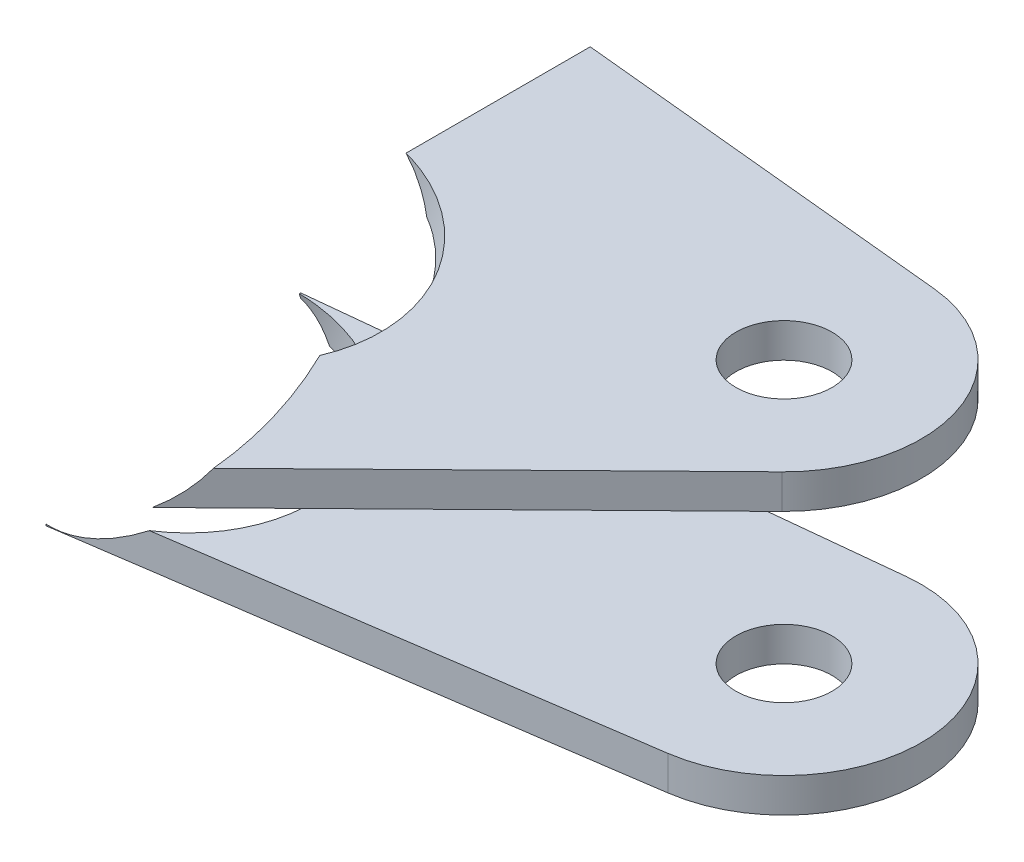
ISO-10303-21;
HEADER;
FILE_DESCRIPTION(('STEP AP214'),'2;1');
FILE_NAME('part.step','',(''),(''),'','','');
FILE_SCHEMA(('AUTOMOTIVE_DESIGN { 1 0 10303 214 1 1 1 1 }'));
ENDSEC;
DATA;
#1=APPLICATION_CONTEXT('core data for automotive mechanical design processes');
#2=APPLICATION_PROTOCOL_DEFINITION('international standard','automotive_design',2000,#1);
#3=PRODUCT_CONTEXT('',#1,'mechanical');
#4=PRODUCT('Part','Part','',(#3));
#5=PRODUCT_RELATED_PRODUCT_CATEGORY('part','',(#4));
#6=PRODUCT_DEFINITION_FORMATION('','',#4);
#7=PRODUCT_DEFINITION_CONTEXT('part definition',#1,'design');
#8=PRODUCT_DEFINITION('design','',#6,#7);
#9=PRODUCT_DEFINITION_SHAPE('','',#8);
#10=(LENGTH_UNIT() NAMED_UNIT(*) SI_UNIT(.MILLI.,.METRE.));
#11=(NAMED_UNIT(*) PLANE_ANGLE_UNIT() SI_UNIT($,.RADIAN.));
#12=(NAMED_UNIT(*) SI_UNIT($,.STERADIAN.) SOLID_ANGLE_UNIT());
#13=UNCERTAINTY_MEASURE_WITH_UNIT(LENGTH_MEASURE(1.E-05),#10,'distance_accuracy_value','');
#14=(GEOMETRIC_REPRESENTATION_CONTEXT(3) GLOBAL_UNCERTAINTY_ASSIGNED_CONTEXT((#13)) GLOBAL_UNIT_ASSIGNED_CONTEXT((#10,
#11,#12)) REPRESENTATION_CONTEXT('',''));
#15=CARTESIAN_POINT('',(0.,0.,0.));
#16=DIRECTION('',(0.,0.,1.));
#17=DIRECTION('',(1.,0.,0.));
#18=AXIS2_PLACEMENT_3D('',#15,#16,#17);
#19=CARTESIAN_POINT('',(0.,129.999999999984,0.));
#20=DIRECTION('',(0.,1.,0.));
#21=DIRECTION('',(0.,0.,1.));
#22=AXIS2_PLACEMENT_3D('',#19,#20,#21);
#23=PLANE('',#22);
#24=CARTESIAN_POINT('',(150.000000000001,129.999999999983,-413.499999999996));
#25=DIRECTION('',(0.,1.,0.));
#26=DIRECTION('',(0.,0.,1.));
#27=AXIS2_PLACEMENT_3D('',#24,#25,#26);
#28=CIRCLE('',#27,4.2);
#29=CARTESIAN_POINT('',(150.000000000001,129.999999999983,-409.299999999996));
#30=VERTEX_POINT('',#29);
#31=EDGE_CURVE('E223',#30,#30,#28,.T.);
#32=ORIENTED_EDGE('',*,*,#31,.F.);
#33=EDGE_LOOP('',(#32));
#34=FACE_BOUND('',#33,.T.);
#35=DIRECTION('',(-0.995181623730551,0.,-0.0980486399141967));
#36=VECTOR('',#35,1.);
#37=CARTESIAN_POINT('',(151.176583678971,129.999999999983,-425.442179484763));
#38=LINE('',#37,#36);
#39=CARTESIAN_POINT('',(151.176583678971,129.999999999983,-425.442179484763));
#40=VERTEX_POINT('',#39);
#41=CARTESIAN_POINT('',(117.828793010442,129.999999999983,-428.727715954916));
#42=VERTEX_POINT('',#41);
#43=EDGE_CURVE('E242',#40,#42,#38,.T.);
#44=ORIENTED_EDGE('',*,*,#43,.T.);
#45=DIRECTION('',(0.,0.,-1.));
#46=VECTOR('',#45,1.);
#47=CARTESIAN_POINT('',(117.828793010442,129.999999999984,-403.));
#48=LINE('',#47,#46);
#49=CARTESIAN_POINT('',(117.828793010442,129.999999999984,-412.626148976256));
#50=VERTEX_POINT('',#49);
#51=EDGE_CURVE('E169',#42,#50,#48,.F.);
#52=ORIENTED_EDGE('',*,*,#51,.T.);
#53=CARTESIAN_POINT('',(115.677419354829,129.999999999984,-399.903225806457));
#54=DIRECTION('',(0.,1.,0.));
#55=DIRECTION('',(-0.877895572914384,0.,-0.478852130680575));
#56=AXIS2_PLACEMENT_3D('',#53,#54,#55);
#57=ELLIPSE('',#56,15.1243670776836,12.7);
#58=CARTESIAN_POINT('',(129.379950738288,129.999999999984,-393.53178989143));
#59=VERTEX_POINT('',#58);
#60=EDGE_CURVE('E212',#50,#59,#57,.F.);
#61=ORIENTED_EDGE('',*,*,#60,.T.);
#62=CARTESIAN_POINT('',(117.499999999987,129.999999999984,-388.875000000024));
#63=DIRECTION('',(0.,1.,0.));
#64=DIRECTION('',(0.468964724171833,0.,0.883216897190286));
#65=AXIS2_PLACEMENT_3D('',#62,#63,#64);
#66=ELLIPSE('',#65,23.9544229018881,12.7);
#67=CARTESIAN_POINT('',(133.273216735541,129.999999999983,-380.347339280954));
#68=VERTEX_POINT('',#67);
#69=EDGE_CURVE('E215',#59,#68,#66,.F.);
#70=ORIENTED_EDGE('',*,*,#69,.T.);
#71=DIRECTION('',(0.71480003288337,0.,-0.699328901869452));
#72=VECTOR('',#71,1.);
#73=CARTESIAN_POINT('',(124.273404694259,129.999999999983,-371.542319160189));
#74=LINE('',#73,#72);
#75=CARTESIAN_POINT('',(158.391946822434,129.999999999983,-404.922399605396));
#76=VERTEX_POINT('',#75);
#77=EDGE_CURVE('E208',#68,#76,#74,.T.);
#78=ORIENTED_EDGE('',*,*,#77,.T.);
#79=CARTESIAN_POINT('',(150.000000000001,129.999999999983,-413.499999999996));
#80=DIRECTION('',(0.,1.,0.));
#81=DIRECTION('',(0.,0.,1.));
#82=AXIS2_PLACEMENT_3D('',#79,#80,#81);
#83=CIRCLE('',#82,12.);
#84=EDGE_CURVE('E229',#76,#40,#83,.T.);
#85=ORIENTED_EDGE('',*,*,#84,.T.);
#86=EDGE_LOOP('',(#44,#52,#61,#70,#78,#85));
#87=FACE_BOUND('',#86,.T.);
#88=ADVANCED_FACE('F153',(#34,#87),#23,.T.);
#89=CARTESIAN_POINT('',(0.,126.999999999984,0.));
#90=DIRECTION('',(0.,1.,0.));
#91=DIRECTION('',(0.,0.,1.));
#92=AXIS2_PLACEMENT_3D('',#89,#90,#91);
#93=PLANE('',#92);
#94=CARTESIAN_POINT('',(150.000000000001,126.999999999983,-413.499999999996));
#95=DIRECTION('',(0.,1.,0.));
#96=DIRECTION('',(0.,0.,1.));
#97=AXIS2_PLACEMENT_3D('',#94,#95,#96);
#98=CIRCLE('',#97,4.2);
#99=CARTESIAN_POINT('',(150.000000000001,126.999999999983,-409.299999999996));
#100=VERTEX_POINT('',#99);
#101=EDGE_CURVE('E233',#100,#100,#98,.T.);
#102=ORIENTED_EDGE('',*,*,#101,.T.);
#103=EDGE_LOOP('',(#102));
#104=FACE_BOUND('',#103,.T.);
#105=DIRECTION('',(0.,0.,-1.));
#106=VECTOR('',#105,1.);
#107=CARTESIAN_POINT('',(120.596697598793,126.999999999984,-403.));
#108=LINE('',#107,#106);
#109=CARTESIAN_POINT('',(120.596697598793,126.999999999983,-428.455012687664));
#110=VERTEX_POINT('',#109);
#111=CARTESIAN_POINT('',(120.596697598792,126.999999999984,-411.674149305966));
#112=VERTEX_POINT('',#111);
#113=EDGE_CURVE('E162',#110,#112,#108,.F.);
#114=ORIENTED_EDGE('',*,*,#113,.F.);
#115=DIRECTION('',(-0.995181623730551,0.,-0.0980486399141967));
#116=VECTOR('',#115,1.);
#117=CARTESIAN_POINT('',(151.176583678971,126.999999999983,-425.442179484763));
#118=LINE('',#117,#116);
#119=CARTESIAN_POINT('',(151.176583678971,126.999999999983,-425.442179484763));
#120=VERTEX_POINT('',#119);
#121=EDGE_CURVE('E236',#120,#110,#118,.T.);
#122=ORIENTED_EDGE('',*,*,#121,.F.);
#123=CARTESIAN_POINT('',(150.000000000001,126.999999999983,-413.499999999996));
#124=DIRECTION('',(0.,1.,0.));
#125=DIRECTION('',(0.,0.,1.));
#126=AXIS2_PLACEMENT_3D('',#123,#124,#125);
#127=CIRCLE('',#126,12.);
#128=CARTESIAN_POINT('',(158.391946822434,126.999999999983,-404.922399605396));
#129=VERTEX_POINT('',#128);
#130=EDGE_CURVE('E260',#129,#120,#127,.T.);
#131=ORIENTED_EDGE('',*,*,#130,.F.);
#132=DIRECTION('',(0.71480003288337,0.,-0.699328901869452));
#133=VECTOR('',#132,1.);
#134=CARTESIAN_POINT('',(124.273404694259,126.999999999983,-371.542319160189));
#135=LINE('',#134,#133);
#136=CARTESIAN_POINT('',(130.56998191002,126.999999999983,-377.702613266601));
#137=VERTEX_POINT('',#136);
#138=EDGE_CURVE('E251',#137,#129,#135,.T.);
#139=ORIENTED_EDGE('',*,*,#138,.F.);
#140=CARTESIAN_POINT('',(115.249999999987,126.999999999984,-393.112500000024));
#141=DIRECTION('',(0.,1.,0.));
#142=DIRECTION('',(0.468964724171833,0.,0.883216897190286));
#143=AXIS2_PLACEMENT_3D('',#140,#141,#142);
#144=ELLIPSE('',#143,23.9544229018881,12.7);
#145=CARTESIAN_POINT('',(128.106561660816,126.999999999984,-395.637470463752));
#146=VERTEX_POINT('',#145);
#147=EDGE_CURVE('E222',#146,#137,#144,.F.);
#148=ORIENTED_EDGE('',*,*,#147,.F.);
#149=CARTESIAN_POINT('',(113.974193548378,126.999999999984,-400.832258064521));
#150=DIRECTION('',(0.,1.,0.));
#151=DIRECTION('',(-0.877895572914384,0.,-0.478852130680575));
#152=AXIS2_PLACEMENT_3D('',#149,#150,#151);
#153=ELLIPSE('',#152,15.1243670776836,12.7);
#154=EDGE_CURVE('E188',#112,#146,#153,.F.);
#155=ORIENTED_EDGE('',*,*,#154,.F.);
#156=EDGE_LOOP('',(#114,#122,#131,#139,#148,#155));
#157=FACE_BOUND('',#156,.T.);
#158=ADVANCED_FACE('F280',(#104,#157),#93,.F.);
#159=CARTESIAN_POINT('',(151.176583678971,126.999999999983,-425.442179484763));
#160=DIRECTION('',(0.0980486399141967,0.,-0.995181623730551));
#161=DIRECTION('',(-0.995181623730551,0.,-0.0980486399141967));
#162=AXIS2_PLACEMENT_3D('',#159,#160,#161);
#163=PLANE('',#162);
#164=ORIENTED_EDGE('',*,*,#121,.T.);
#165=CARTESIAN_POINT('',(110.000000000002,120.,-429.499034966983));
#166=DIRECTION('',(0.0980486399141967,0.,-0.995181623730551));
#167=DIRECTION('',(-0.995181623730551,0.,-0.0980486399141967));
#168=AXIS2_PLACEMENT_3D('',#165,#166,#167);
#169=ELLIPSE('',#168,12.7614896589354,12.7);
#170=EDGE_CURVE('E178',#110,#42,#169,.F.);
#171=ORIENTED_EDGE('',*,*,#170,.T.);
#172=ORIENTED_EDGE('',*,*,#43,.F.);
#173=DIRECTION('',(0.,1.,0.));
#174=VECTOR('',#173,1.);
#175=CARTESIAN_POINT('',(151.176583678971,126.999999999983,-425.442179484763));
#176=LINE('',#175,#174);
#177=EDGE_CURVE('E239',#120,#40,#176,.T.);
#178=ORIENTED_EDGE('',*,*,#177,.F.);
#179=EDGE_LOOP('',(#164,#171,#172,#178));
#180=FACE_BOUND('',#179,.T.);
#181=ADVANCED_FACE('F278',(#180),#163,.T.);
#182=CARTESIAN_POINT('',(124.273404694259,126.999999999983,-371.542319160189));
#183=DIRECTION('',(0.699328901869452,0.,0.71480003288337));
#184=DIRECTION('',(0.71480003288337,0.,-0.699328901869452));
#185=AXIS2_PLACEMENT_3D('',#182,#183,#184);
#186=PLANE('',#185);
#187=ORIENTED_EDGE('',*,*,#77,.F.);
#188=CARTESIAN_POINT('',(125.872495812797,141.163327750396,-373.106799552566));
#189=DIRECTION('',(0.699328901869452,0.,0.71480003288337));
#190=DIRECTION('',(-0.294250436326702,0.911340122510021,0.287881680252435));
#191=AXIS2_PLACEMENT_3D('',#188,#189,#190);
#192=ELLIPSE('',#191,15.6141159607019,12.7);
#193=EDGE_CURVE('E227',#68,#137,#192,.F.);
#194=ORIENTED_EDGE('',*,*,#193,.T.);
#195=ORIENTED_EDGE('',*,*,#138,.T.);
#196=DIRECTION('',(0.,1.,0.));
#197=VECTOR('',#196,1.);
#198=CARTESIAN_POINT('',(158.391946822434,126.999999999983,-404.922399605396));
#199=LINE('',#198,#197);
#200=EDGE_CURVE('E253',#129,#76,#199,.T.);
#201=ORIENTED_EDGE('',*,*,#200,.T.);
#202=EDGE_LOOP('',(#187,#194,#195,#201));
#203=FACE_BOUND('',#202,.T.);
#204=ADVANCED_FACE('F302',(#203),#186,.T.);
#205=CARTESIAN_POINT('',(150.000000000001,126.999999999983,-413.499999999996));
#206=DIRECTION('',(0.,1.,0.));
#207=DIRECTION('',(0.,0.,1.));
#208=AXIS2_PLACEMENT_3D('',#205,#206,#207);
#209=CYLINDRICAL_SURFACE('',#208,12.);
#210=ORIENTED_EDGE('',*,*,#84,.F.);
#211=ORIENTED_EDGE('',*,*,#200,.F.);
#212=ORIENTED_EDGE('',*,*,#130,.T.);
#213=ORIENTED_EDGE('',*,*,#177,.T.);
#214=EDGE_LOOP('',(#210,#211,#212,#213));
#215=FACE_BOUND('',#214,.T.);
#216=ADVANCED_FACE('F274',(#215),#209,.T.);
#217=CARTESIAN_POINT('',(150.000000000001,126.999999999983,-413.499999999996));
#218=DIRECTION('',(0.,1.,0.));
#219=DIRECTION('',(0.,0.,1.));
#220=AXIS2_PLACEMENT_3D('',#217,#218,#219);
#221=CYLINDRICAL_SURFACE('',#220,4.2);
#222=ORIENTED_EDGE('',*,*,#101,.F.);
#223=EDGE_LOOP('',(#222));
#224=FACE_BOUND('',#223,.T.);
#225=ORIENTED_EDGE('',*,*,#31,.T.);
#226=EDGE_LOOP('',(#225));
#227=FACE_BOUND('',#226,.T.);
#228=ADVANCED_FACE('F298',(#224,#227),#221,.F.);
#229=CARTESIAN_POINT('',(110.,120.000000000001,-403.));
#230=DIRECTION('',(0.39763011778711,0.530173490382813,0.748870055165724));
#231=DIRECTION('',(0.,0.816166405739152,-0.577816924417098));
#232=AXIS2_PLACEMENT_3D('',#229,#230,#231);
#233=CYLINDRICAL_SURFACE('',#232,12.7);
#234=CARTESIAN_POINT('',(110.,120.000000000001,-403.));
#235=DIRECTION('',(-0.135460689526749,-0.530043533624192,0.83708079302784));
#236=DIRECTION('',(0.45710219768246,0.716146953034335,0.527438264191652));
#237=AXIS2_PLACEMENT_3D('',#234,#235,#236);
#238=ELLIPSE('',#237,43.4951676326408,12.7);
#239=EDGE_CURVE('E217',#59,#146,#238,.F.);
#240=ORIENTED_EDGE('',*,*,#239,.T.);
#241=ORIENTED_EDGE('',*,*,#147,.T.);
#242=ORIENTED_EDGE('',*,*,#193,.F.);
#243=ORIENTED_EDGE('',*,*,#69,.F.);
#244=EDGE_LOOP('',(#240,#241,#242,#243));
#245=FACE_BOUND('',#244,.T.);
#246=ADVANCED_FACE('F225',(#245),#233,.F.);
#247=CARTESIAN_POINT('',(198.,275.000000000001,-355.));
#248=DIRECTION('',(-0.476735492044766,-0.839704559851576,-0.260037541115328));
#249=DIRECTION('',(-0.869620813975533,0.493720204063528,0.));
#250=AXIS2_PLACEMENT_3D('',#247,#248,#249);
#251=CYLINDRICAL_SURFACE('',#250,12.7);
#252=CARTESIAN_POINT('',(110.000000000002,119.999999999999,-403.));
#253=DIRECTION('',(-0.300310657917469,-0.528956272468255,-0.793737217571197));
#254=DIRECTION('',(0.391884101032063,0.690250405226942,-0.608260823530773));
#255=AXIS2_PLACEMENT_3D('',#252,#253,#254);
#256=ELLIPSE('',#255,16.0002576657064,12.7);
#257=EDGE_CURVE('E13',#112,#50,#256,.F.);
#258=ORIENTED_EDGE('',*,*,#257,.F.);
#259=ORIENTED_EDGE('',*,*,#154,.T.);
#260=ORIENTED_EDGE('',*,*,#239,.F.);
#261=ORIENTED_EDGE('',*,*,#60,.F.);
#262=EDGE_LOOP('',(#258,#259,#260,#261));
#263=FACE_BOUND('',#262,.T.);
#264=ADVANCED_FACE('F218',(#263),#251,.F.);
#265=CARTESIAN_POINT('',(110.000000000002,119.999999999999,-403.));
#266=DIRECTION('',(0.,0.,-1.));
#267=DIRECTION('',(-1.,0.,0.));
#268=AXIS2_PLACEMENT_3D('',#265,#266,#267);
#269=CYLINDRICAL_SURFACE('',#268,12.7);
#270=ORIENTED_EDGE('',*,*,#170,.F.);
#271=ORIENTED_EDGE('',*,*,#113,.T.);
#272=ORIENTED_EDGE('',*,*,#257,.T.);
#273=ORIENTED_EDGE('',*,*,#51,.F.);
#274=EDGE_LOOP('',(#270,#271,#272,#273));
#275=FACE_BOUND('',#274,.T.);
#276=ADVANCED_FACE('F282',(#275),#269,.F.);
#277=CLOSED_SHELL('',(#88,#158,#181,#204,#216,#228,#246,#264,#276));
#278=MANIFOLD_SOLID_BREP('B2',#277);
#279=CARTESIAN_POINT('',(102.6193548387,106.999999999983,-407.025806451618));
#280=DIRECTION('',(0.99079318757816,0.,-0.135384118155377));
#281=DIRECTION('',(-0.135384118155377,0.,-0.99079318757816));
#282=AXIS2_PLACEMENT_3D('',#279,#280,#281);
#283=PLANE('',#282);
#284=CARTESIAN_POINT('',(102.6193548387,106.999999999983,-407.025806451618));
#285=DIRECTION('',(0.99079318757816,0.,-0.135384118155377));
#286=DIRECTION('',(0.048498102467281,0.933634927936478,0.354927817160222));
#287=AXIS2_PLACEMENT_3D('',#284,#285,#286);
#288=ELLIPSE('',#287,29.0523894338285,12.7);
#289=CARTESIAN_POINT('',(100.803128909117,106.999999999983,-420.317648232268));
#290=VERTEX_POINT('',#289);
#291=CARTESIAN_POINT('',(100.78698826747,106.600375757589,-420.435771672477));
#292=VERTEX_POINT('',#291);
#293=EDGE_CURVE('E382',#290,#292,#288,.F.);
#294=ORIENTED_EDGE('',*,*,#293,.F.);
#295=DIRECTION('',(0.135384118155377,0.,0.99079318757816));
#296=VECTOR('',#295,1.);
#297=CARTESIAN_POINT('',(102.6193548387,106.999999999983,-407.025806451618));
#298=LINE('',#297,#296);
#299=CARTESIAN_POINT('',(100.78698826747,106.999999999983,-420.435771672477));
#300=VERTEX_POINT('',#299);
#301=EDGE_CURVE('E439',#300,#290,#298,.T.);
#302=ORIENTED_EDGE('',*,*,#301,.F.);
#303=DIRECTION('',(0.,-1.,0.));
#304=VECTOR('',#303,1.);
#305=CARTESIAN_POINT('',(100.78698826747,106.999999999983,-420.435771672477));
#306=LINE('',#305,#304);
#307=EDGE_CURVE('E434',#300,#292,#306,.T.);
#308=ORIENTED_EDGE('',*,*,#307,.T.);
#309=EDGE_LOOP('',(#294,#302,#308));
#310=FACE_BOUND('',#309,.T.);
#311=ADVANCED_FACE('F372',(#310),#283,.F.);
#312=CARTESIAN_POINT('',(104.302135670505,104.,-394.710567359647));
#313=VERTEX_POINT('',#312);
#314=CARTESIAN_POINT('',(104.308319697217,104.128946119377,-394.665310267292));
#315=VERTEX_POINT('',#314);
#316=EDGE_CURVE('E429',#313,#315,#288,.F.);
#317=ORIENTED_EDGE('',*,*,#316,.F.);
#318=DIRECTION('',(0.135384118155377,0.,0.99079318757816));
#319=VECTOR('',#318,1.);
#320=CARTESIAN_POINT('',(102.6193548387,103.999999999983,-407.025806451618));
#321=LINE('',#320,#319);
#322=CARTESIAN_POINT('',(104.308319697217,103.999999999983,-394.665310267292));
#323=VERTEX_POINT('',#322);
#324=EDGE_CURVE('E440',#313,#323,#321,.T.);
#325=ORIENTED_EDGE('',*,*,#324,.T.);
#326=DIRECTION('',(0.,-1.,0.));
#327=VECTOR('',#326,1.);
#328=CARTESIAN_POINT('',(104.308319697217,106.999999999983,-394.665310267292));
#329=LINE('',#328,#327);
#330=EDGE_CURVE('E465',#315,#323,#329,.T.);
#331=ORIENTED_EDGE('',*,*,#330,.F.);
#332=EDGE_LOOP('',(#317,#325,#331));
#333=FACE_BOUND('',#332,.T.);
#334=ADVANCED_FACE('F492',(#333),#283,.F.);
#335=CARTESIAN_POINT('',(148.756037439207,106.999999999983,-425.435349058459));
#336=DIRECTION('',(0.103663546732772,0.,0.994612421538552));
#337=DIRECTION('',(0.994612421538552,0.,-0.103663546732772));
#338=AXIS2_PLACEMENT_3D('',#335,#336,#337);
#339=PLANE('',#338);
#340=CARTESIAN_POINT('',(81.6845071384395,70.1261205279333,-418.444814288124));
#341=DIRECTION('',(0.103663546732772,0.,0.994612421538552));
#342=DIRECTION('',(0.467538576545247,0.882628540577595,-0.0487292396812206));
#343=AXIS2_PLACEMENT_3D('',#340,#341,#342);
#344=ELLIPSE('',#343,41.2261821664589,12.7);
#345=CARTESIAN_POINT('',(103.079080776526,104.000000000001,-420.674665168861));
#346=VERTEX_POINT('',#345);
#347=EDGE_CURVE('E151',#292,#346,#344,.F.);
#348=ORIENTED_EDGE('',*,*,#347,.F.);
#349=ORIENTED_EDGE('',*,*,#307,.F.);
#350=DIRECTION('',(-0.994612421538552,0.,0.103663546732772));
#351=VECTOR('',#350,1.);
#352=CARTESIAN_POINT('',(148.756037439207,106.999999999983,-425.435349058459));
#353=LINE('',#352,#351);
#354=CARTESIAN_POINT('',(148.756037439207,106.999999999983,-425.435349058459));
#355=VERTEX_POINT('',#354);
#356=EDGE_CURVE('E464',#355,#300,#353,.T.);
#357=ORIENTED_EDGE('',*,*,#356,.F.);
#358=DIRECTION('',(0.,-1.,0.));
#359=VECTOR('',#358,1.);
#360=CARTESIAN_POINT('',(148.756037439207,106.999999999983,-425.435349058459));
#361=LINE('',#360,#359);
#362=CARTESIAN_POINT('',(148.756037439207,103.999999999983,-425.435349058459));
#363=VERTEX_POINT('',#362);
#364=EDGE_CURVE('E442',#355,#363,#361,.T.);
#365=ORIENTED_EDGE('',*,*,#364,.T.);
#366=DIRECTION('',(-0.994612421538552,0.,0.103663546732772));
#367=VECTOR('',#366,1.);
#368=CARTESIAN_POINT('',(148.756037439207,103.999999999983,-425.435349058459));
#369=LINE('',#368,#367);
#370=EDGE_CURVE('E438',#363,#346,#369,.T.);
#371=ORIENTED_EDGE('',*,*,#370,.T.);
#372=EDGE_LOOP('',(#348,#349,#357,#365,#371));
#373=FACE_BOUND('',#372,.T.);
#374=ADVANCED_FACE('F433',(#373),#339,.F.);
#375=CARTESIAN_POINT('',(0.,103.999999999984,0.));
#376=DIRECTION('',(0.,1.,0.));
#377=DIRECTION('',(0.,0.,1.));
#378=AXIS2_PLACEMENT_3D('',#375,#376,#377);
#379=PLANE('',#378);
#380=ORIENTED_EDGE('',*,*,#324,.F.);
#381=CARTESIAN_POINT('',(100.916129032258,104.000000000001,-407.954838709677));
#382=DIRECTION('',(0.,1.,0.));
#383=DIRECTION('',(0.877895572914382,0.,0.478852130680579));
#384=AXIS2_PLACEMENT_3D('',#381,#382,#383);
#385=ELLIPSE('',#384,15.1243670776836,12.7);
#386=EDGE_CURVE('E388',#313,#346,#385,.T.);
#387=ORIENTED_EDGE('',*,*,#386,.T.);
#388=ORIENTED_EDGE('',*,*,#370,.F.);
#389=CARTESIAN_POINT('',(150.000000000001,103.999999999983,-413.499999999996));
#390=DIRECTION('',(0.,1.,0.));
#391=DIRECTION('',(0.,0.,1.));
#392=AXIS2_PLACEMENT_3D('',#389,#390,#391);
#393=CIRCLE('',#392,12.);
#394=CARTESIAN_POINT('',(151.742561918462,103.999999999983,-401.627195867849));
#395=VERTEX_POINT('',#394);
#396=EDGE_CURVE('E489',#395,#363,#393,.T.);
#397=ORIENTED_EDGE('',*,*,#396,.F.);
#398=DIRECTION('',(0.989400344345584,0.,-0.145213493205146));
#399=VECTOR('',#398,1.);
#400=CARTESIAN_POINT('',(104.308319697217,103.999999999983,-394.665310267292));
#401=LINE('',#400,#399);
#402=EDGE_CURVE('E470',#323,#395,#401,.T.);
#403=ORIENTED_EDGE('',*,*,#402,.F.);
#404=EDGE_LOOP('',(#380,#387,#388,#397,#403));
#405=FACE_BOUND('',#404,.T.);
#406=CARTESIAN_POINT('',(150.000000000001,103.999999999983,-413.499999999996));
#407=DIRECTION('',(0.,1.,0.));
#408=DIRECTION('',(0.,0.,1.));
#409=AXIS2_PLACEMENT_3D('',#406,#407,#408);
#410=CIRCLE('',#409,4.2);
#411=CARTESIAN_POINT('',(150.000000000001,103.999999999983,-409.299999999996));
#412=VERTEX_POINT('',#411);
#413=EDGE_CURVE('E448',#412,#412,#410,.T.);
#414=ORIENTED_EDGE('',*,*,#413,.T.);
#415=EDGE_LOOP('',(#414));
#416=FACE_BOUND('',#415,.T.);
#417=ADVANCED_FACE('F374',(#405,#416),#379,.F.);
#418=CARTESIAN_POINT('',(0.,106.999999999984,0.));
#419=DIRECTION('',(0.,1.,0.));
#420=DIRECTION('',(0.,0.,1.));
#421=AXIS2_PLACEMENT_3D('',#418,#419,#420);
#422=PLANE('',#421);
#423=ORIENTED_EDGE('',*,*,#301,.T.);
#424=CARTESIAN_POINT('',(102.6193548387,106.999999999984,-407.025806451618));
#425=DIRECTION('',(0.,1.,0.));
#426=DIRECTION('',(0.877895572914381,0.,0.47885213068058));
#427=AXIS2_PLACEMENT_3D('',#424,#425,#426);
#428=ELLIPSE('',#427,15.1243670776836,12.7);
#429=CARTESIAN_POINT('',(112.196559869981,106.999999999983,-395.823060936447));
#430=VERTEX_POINT('',#429);
#431=EDGE_CURVE('E423',#290,#430,#428,.F.);
#432=ORIENTED_EDGE('',*,*,#431,.T.);
#433=DIRECTION('',(0.989400344345584,0.,-0.145213493205146));
#434=VECTOR('',#433,1.);
#435=CARTESIAN_POINT('',(104.308319697217,106.999999999983,-394.665310267292));
#436=LINE('',#435,#434);
#437=CARTESIAN_POINT('',(151.742561918462,106.999999999983,-401.627195867849));
#438=VERTEX_POINT('',#437);
#439=EDGE_CURVE('E456',#430,#438,#436,.T.);
#440=ORIENTED_EDGE('',*,*,#439,.T.);
#441=CARTESIAN_POINT('',(150.000000000001,106.999999999983,-413.499999999996));
#442=DIRECTION('',(0.,1.,0.));
#443=DIRECTION('',(0.,0.,1.));
#444=AXIS2_PLACEMENT_3D('',#441,#442,#443);
#445=CIRCLE('',#444,12.);
#446=EDGE_CURVE('E466',#438,#355,#445,.T.);
#447=ORIENTED_EDGE('',*,*,#446,.T.);
#448=ORIENTED_EDGE('',*,*,#356,.T.);
#449=EDGE_LOOP('',(#423,#432,#440,#447,#448));
#450=FACE_BOUND('',#449,.T.);
#451=CARTESIAN_POINT('',(150.000000000001,106.999999999983,-413.499999999996));
#452=DIRECTION('',(0.,1.,0.));
#453=DIRECTION('',(0.,0.,1.));
#454=AXIS2_PLACEMENT_3D('',#451,#452,#453);
#455=CIRCLE('',#454,4.2);
#456=CARTESIAN_POINT('',(150.000000000001,106.999999999983,-409.299999999996));
#457=VERTEX_POINT('',#456);
#458=EDGE_CURVE('E451',#457,#457,#455,.T.);
#459=ORIENTED_EDGE('',*,*,#458,.F.);
#460=EDGE_LOOP('',(#459));
#461=FACE_BOUND('',#460,.T.);
#462=ADVANCED_FACE('F499',(#450,#461),#422,.T.);
#463=CARTESIAN_POINT('',(104.308319697217,106.999999999983,-394.665310267292));
#464=DIRECTION('',(-0.145213493205146,0.,-0.989400344345583));
#465=DIRECTION('',(-0.989400344345584,0.,0.145213493205146));
#466=AXIS2_PLACEMENT_3D('',#463,#464,#465);
#467=PLANE('',#466);
#468=CARTESIAN_POINT('',(120.833674055481,139.082039529541,-397.090723242465));
#469=DIRECTION('',(-0.145213493205146,0.,-0.989400344345583));
#470=DIRECTION('',(0.454215690301147,0.888394001307914,-0.0666648717419256));
#471=AXIS2_PLACEMENT_3D('',#468,#469,#470);
#472=ELLIPSE('',#471,38.8962459623988,12.7);
#473=EDGE_CURVE('E427',#315,#430,#472,.F.);
#474=ORIENTED_EDGE('',*,*,#473,.F.);
#475=ORIENTED_EDGE('',*,*,#330,.T.);
#476=ORIENTED_EDGE('',*,*,#402,.T.);
#477=DIRECTION('',(0.,-1.,0.));
#478=VECTOR('',#477,1.);
#479=CARTESIAN_POINT('',(151.742561918462,106.999999999983,-401.627195867849));
#480=LINE('',#479,#478);
#481=EDGE_CURVE('E454',#438,#395,#480,.T.);
#482=ORIENTED_EDGE('',*,*,#481,.F.);
#483=ORIENTED_EDGE('',*,*,#439,.F.);
#484=EDGE_LOOP('',(#474,#475,#476,#482,#483));
#485=FACE_BOUND('',#484,.T.);
#486=ADVANCED_FACE('F495',(#485),#467,.F.);
#487=CARTESIAN_POINT('',(150.000000000001,106.999999999983,-413.499999999996));
#488=DIRECTION('',(0.,-1.,0.));
#489=DIRECTION('',(0.,0.,-1.));
#490=AXIS2_PLACEMENT_3D('',#487,#488,#489);
#491=CYLINDRICAL_SURFACE('',#490,12.);
#492=ORIENTED_EDGE('',*,*,#396,.T.);
#493=ORIENTED_EDGE('',*,*,#364,.F.);
#494=ORIENTED_EDGE('',*,*,#446,.F.);
#495=ORIENTED_EDGE('',*,*,#481,.T.);
#496=EDGE_LOOP('',(#492,#493,#494,#495));
#497=FACE_BOUND('',#496,.T.);
#498=ADVANCED_FACE('F501',(#497),#491,.T.);
#499=CARTESIAN_POINT('',(150.000000000001,106.999999999983,-413.499999999996));
#500=DIRECTION('',(0.,-1.,0.));
#501=DIRECTION('',(0.,0.,-1.));
#502=AXIS2_PLACEMENT_3D('',#499,#500,#501);
#503=CYLINDRICAL_SURFACE('',#502,4.2);
#504=ORIENTED_EDGE('',*,*,#458,.T.);
#505=EDGE_LOOP('',(#504));
#506=FACE_BOUND('',#505,.T.);
#507=ORIENTED_EDGE('',*,*,#413,.F.);
#508=EDGE_LOOP('',(#507));
#509=FACE_BOUND('',#508,.T.);
#510=ADVANCED_FACE('F515',(#506,#509),#503,.F.);
#511=CARTESIAN_POINT('',(92.967744212795,90.0000040111732,-412.290321338476));
#512=DIRECTION('',(0.476735492044763,0.839704559851577,0.26003754111533));
#513=DIRECTION('',(0.869620813975534,-0.493720204063526,0.));
#514=AXIS2_PLACEMENT_3D('',#511,#512,#513);
#515=CYLINDRICAL_SURFACE('',#514,12.7);
#516=ORIENTED_EDGE('',*,*,#316,.T.);
#517=ORIENTED_EDGE('',*,*,#473,.T.);
#518=ORIENTED_EDGE('',*,*,#431,.F.);
#519=ORIENTED_EDGE('',*,*,#293,.T.);
#520=ORIENTED_EDGE('',*,*,#347,.T.);
#521=ORIENTED_EDGE('',*,*,#386,.F.);
#522=EDGE_LOOP('',(#516,#517,#518,#519,#520,#521));
#523=FACE_BOUND('',#522,.T.);
#524=ADVANCED_FACE('F421',(#523),#515,.F.);
#525=CLOSED_SHELL('',(#311,#334,#374,#417,#462,#486,#498,#510,#524));
#526=MANIFOLD_SOLID_BREP('B7',#525);
#527=ADVANCED_BREP_SHAPE_REPRESENTATION('',(#18,#278,#526),#14);
#528=SHAPE_DEFINITION_REPRESENTATION(#9,#527);
ENDSEC;
END-ISO-10303-21;
